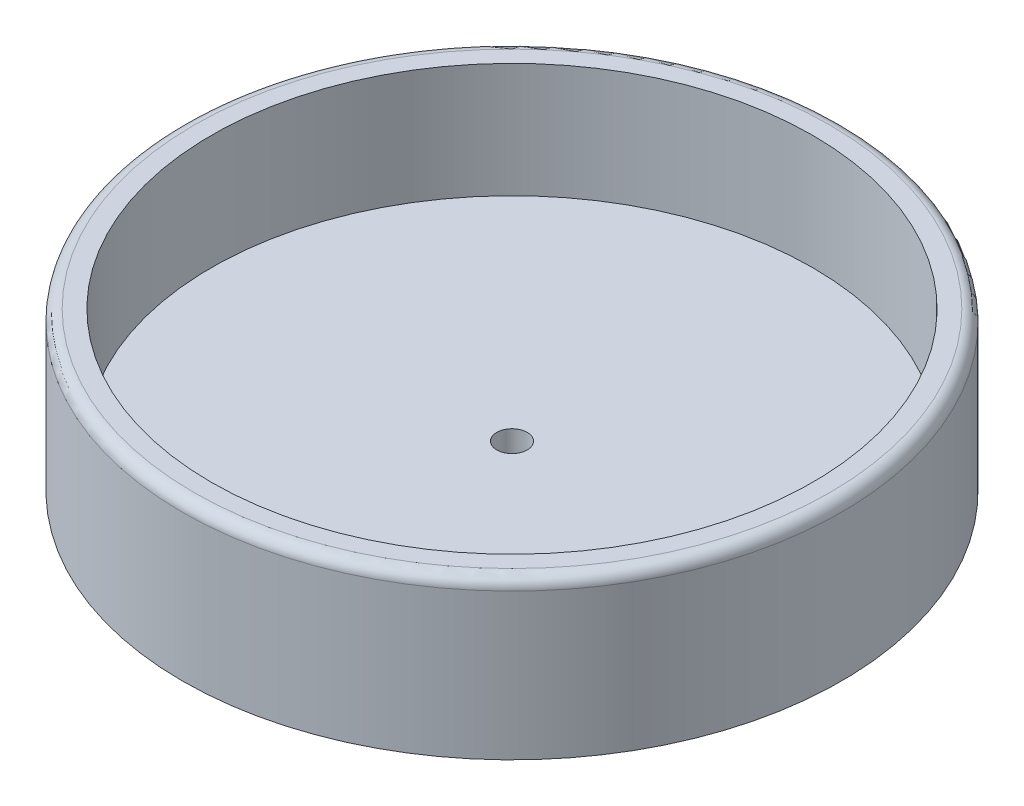
ISO-10303-21;
HEADER;
FILE_DESCRIPTION(('STEP AP214'),'2;1');
FILE_NAME('part.step','',(''),(''),'','','');
FILE_SCHEMA(('AUTOMOTIVE_DESIGN { 1 0 10303 214 1 1 1 1 }'));
ENDSEC;
DATA;
#1=APPLICATION_CONTEXT('core data for automotive mechanical design processes');
#2=APPLICATION_PROTOCOL_DEFINITION('international standard','automotive_design',2000,#1);
#3=PRODUCT_CONTEXT('',#1,'mechanical');
#4=PRODUCT('Part','Part','',(#3));
#5=PRODUCT_RELATED_PRODUCT_CATEGORY('part','',(#4));
#6=PRODUCT_DEFINITION_FORMATION('','',#4);
#7=PRODUCT_DEFINITION_CONTEXT('part definition',#1,'design');
#8=PRODUCT_DEFINITION('design','',#6,#7);
#9=PRODUCT_DEFINITION_SHAPE('','',#8);
#10=(LENGTH_UNIT() NAMED_UNIT(*) SI_UNIT(.MILLI.,.METRE.));
#11=(NAMED_UNIT(*) PLANE_ANGLE_UNIT() SI_UNIT($,.RADIAN.));
#12=(NAMED_UNIT(*) SI_UNIT($,.STERADIAN.) SOLID_ANGLE_UNIT());
#13=UNCERTAINTY_MEASURE_WITH_UNIT(LENGTH_MEASURE(1.E-05),#10,'distance_accuracy_value','');
#14=(GEOMETRIC_REPRESENTATION_CONTEXT(3) GLOBAL_UNCERTAINTY_ASSIGNED_CONTEXT((#13)) GLOBAL_UNIT_ASSIGNED_CONTEXT((#10,
#11,#12)) REPRESENTATION_CONTEXT('',''));
#15=CARTESIAN_POINT('',(0.,0.,0.));
#16=DIRECTION('',(0.,0.,1.));
#17=DIRECTION('',(1.,0.,0.));
#18=AXIS2_PLACEMENT_3D('',#15,#16,#17);
#19=CARTESIAN_POINT('',(0.,9.525,0.));
#20=DIRECTION('',(0.,-1.,0.));
#21=DIRECTION('',(0.,0.,-1.));
#22=AXIS2_PLACEMENT_3D('',#19,#20,#21);
#23=CYLINDRICAL_SURFACE('',#22,73.025);
#24=CARTESIAN_POINT('',(0.,32.385,0.));
#25=DIRECTION('',(0.,1.,0.));
#26=DIRECTION('',(0.,0.,1.));
#27=AXIS2_PLACEMENT_3D('',#24,#25,#26);
#28=CIRCLE('',#27,73.025);
#29=CARTESIAN_POINT('',(0.,32.385,-73.025));
#30=VERTEX_POINT('',#29);
#31=EDGE_CURVE('E10',#30,#30,#28,.F.);
#32=CARTESIAN_POINT('',(0.,0.,0.));
#33=DIRECTION('',(0.,1.,0.));
#34=DIRECTION('',(0.,0.,1.));
#35=AXIS2_PLACEMENT_3D('',#32,#33,#34);
#36=CIRCLE('',#35,73.025);
#37=CARTESIAN_POINT('',(0.,0.,-73.025));
#38=VERTEX_POINT('',#37);
#39=EDGE_CURVE('E59',#38,#38,#36,.T.);
#40=CARTESIAN_POINT('',(0.,32.385,-73.025));
#41=CARTESIAN_POINT('',(0.,32.04765625,-73.025));
#42=CARTESIAN_POINT('',(0.,31.7103125,-73.025));
#43=CARTESIAN_POINT('',(0.,31.035625,-73.025));
#44=CARTESIAN_POINT('',(0.,30.69828125,-73.025));
#45=CARTESIAN_POINT('',(0.,30.02359375,-73.025));
#46=CARTESIAN_POINT('',(0.,29.68625,-73.025));
#47=CARTESIAN_POINT('',(0.,29.0115625,-73.025));
#48=CARTESIAN_POINT('',(0.,28.67421875,-73.025));
#49=CARTESIAN_POINT('',(0.,27.99953125,-73.025));
#50=CARTESIAN_POINT('',(0.,27.6621875,-73.025));
#51=CARTESIAN_POINT('',(0.,26.9875,-73.025));
#52=CARTESIAN_POINT('',(0.,26.65015625,-73.025));
#53=CARTESIAN_POINT('',(0.,25.97546875,-73.025));
#54=CARTESIAN_POINT('',(0.,25.638125,-73.025));
#55=CARTESIAN_POINT('',(0.,24.9634375,-73.025));
#56=CARTESIAN_POINT('',(0.,24.62609375,-73.025));
#57=CARTESIAN_POINT('',(0.,23.95140625,-73.025));
#58=CARTESIAN_POINT('',(0.,23.6140625,-73.025));
#59=CARTESIAN_POINT('',(0.,22.939375,-73.025));
#60=CARTESIAN_POINT('',(0.,22.60203125,-73.025));
#61=CARTESIAN_POINT('',(0.,21.92734375,-73.025));
#62=CARTESIAN_POINT('',(0.,21.59,-73.025));
#63=CARTESIAN_POINT('',(0.,20.9153125,-73.025));
#64=CARTESIAN_POINT('',(0.,20.57796875,-73.025));
#65=CARTESIAN_POINT('',(0.,19.90328125,-73.025));
#66=CARTESIAN_POINT('',(0.,19.5659375,-73.025));
#67=CARTESIAN_POINT('',(0.,18.89125,-73.025));
#68=CARTESIAN_POINT('',(0.,18.55390625,-73.025));
#69=CARTESIAN_POINT('',(0.,17.87921875,-73.025));
#70=CARTESIAN_POINT('',(0.,17.541875,-73.025));
#71=CARTESIAN_POINT('',(0.,16.8671875,-73.025));
#72=CARTESIAN_POINT('',(0.,16.52984375,-73.025));
#73=CARTESIAN_POINT('',(0.,15.85515625,-73.025));
#74=CARTESIAN_POINT('',(0.,15.5178125,-73.025));
#75=CARTESIAN_POINT('',(0.,14.843125,-73.025));
#76=CARTESIAN_POINT('',(0.,14.50578125,-73.025));
#77=CARTESIAN_POINT('',(0.,13.83109375,-73.025));
#78=CARTESIAN_POINT('',(0.,13.49375,-73.025));
#79=CARTESIAN_POINT('',(0.,12.8190625,-73.025));
#80=CARTESIAN_POINT('',(0.,12.48171875,-73.025));
#81=CARTESIAN_POINT('',(0.,11.80703125,-73.025));
#82=CARTESIAN_POINT('',(0.,11.4696875,-73.025));
#83=CARTESIAN_POINT('',(0.,10.795,-73.025));
#84=CARTESIAN_POINT('',(0.,10.45765625,-73.025));
#85=CARTESIAN_POINT('',(0.,9.78296875,-73.025));
#86=CARTESIAN_POINT('',(0.,9.445625,-73.025));
#87=CARTESIAN_POINT('',(0.,8.7709375,-73.025));
#88=CARTESIAN_POINT('',(0.,8.43359375,-73.025));
#89=CARTESIAN_POINT('',(0.,7.75890625,-73.025));
#90=CARTESIAN_POINT('',(0.,7.4215625,-73.025));
#91=CARTESIAN_POINT('',(0.,6.746875,-73.025));
#92=CARTESIAN_POINT('',(0.,6.40953125,-73.025));
#93=CARTESIAN_POINT('',(0.,5.73484375,-73.025));
#94=CARTESIAN_POINT('',(0.,5.3975,-73.025));
#95=CARTESIAN_POINT('',(0.,4.7228125,-73.025));
#96=CARTESIAN_POINT('',(0.,4.38546875,-73.025));
#97=CARTESIAN_POINT('',(0.,3.71078125,-73.025));
#98=CARTESIAN_POINT('',(0.,3.3734375,-73.025));
#99=CARTESIAN_POINT('',(0.,2.69875,-73.025));
#100=CARTESIAN_POINT('',(0.,2.36140625,-73.025));
#101=CARTESIAN_POINT('',(0.,1.68671875,-73.025));
#102=CARTESIAN_POINT('',(0.,1.34937500000001,-73.025));
#103=CARTESIAN_POINT('',(0.,0.674687500000006,-73.025));
#104=CARTESIAN_POINT('',(0.,0.337343750000004,-73.025));
#105=CARTESIAN_POINT('',(0.,0.,-73.025));
#106=B_SPLINE_CURVE_WITH_KNOTS('',3,(#40,#41,#42,#43,#44,#45,#46,#47,#48,#49,#50,#51,#52,#53,
#54,#55,#56,#57,#58,#59,#60,#61,#62,#63,#64,#65,#66,#67,#68,#69,#70,#71,#72,#73,#74,#75,#76,#77,
#78,#79,#80,#81,#82,#83,#84,#85,#86,#87,#88,#89,#90,#91,#92,#93,#94,#95,#96,#97,#98,#99,#100,
#101,#102,#103,#104,#105),.UNSPECIFIED.,.F.,.F.,(4,2,2,2,2,2,2,2,2,2,2,2,2,2,2,2,2,2,2,2,2,2,2,
2,2,2,2,2,2,2,2,2,4),(0.,1.01203125,2.0240625,3.03609375,4.048125,5.06015625,6.0721875,
7.08421875,8.09625,9.10828125,10.1203125,11.13234375,12.144375,13.15640625,14.1684375,
15.18046875,16.1925,17.20453125,18.2165625,19.22859375,20.240625,21.25265625,22.2646875,
23.27671875,24.28875,25.30078125,26.3128125,27.32484375,28.336875,29.34890625,30.3609375,
31.37296875,32.385),.UNSPECIFIED.);
#107=EDGE_CURVE('BSEAM41',#30,#38,#106,.T.);
#108=ORIENTED_EDGE('',*,*,#31,.T.);
#109=ORIENTED_EDGE('',*,*,#39,.T.);
#110=ORIENTED_EDGE('',*,*,#107,.T.);
#111=ORIENTED_EDGE('',*,*,#107,.F.);
#112=EDGE_LOOP('',(#108,#110,#109,#111));
#113=FACE_BOUND('',#112,.T.);
#114=ADVANCED_FACE('F41',(#113),#23,.T.);
#115=CARTESIAN_POINT('',(0.,0.,0.));
#116=DIRECTION('',(0.,1.,0.));
#117=DIRECTION('',(0.,0.,1.));
#118=AXIS2_PLACEMENT_3D('',#115,#116,#117);
#119=PLANE('',#118);
#120=CARTESIAN_POINT('',(0.,0.,0.));
#121=DIRECTION('',(0.,-1.,0.));
#122=DIRECTION('',(0.,0.,-1.));
#123=AXIS2_PLACEMENT_3D('',#120,#121,#122);
#124=CIRCLE('',#123,7.62);
#125=CARTESIAN_POINT('',(0.,0.,-7.62));
#126=VERTEX_POINT('',#125);
#127=EDGE_CURVE('E77',#126,#126,#124,.T.);
#128=ORIENTED_EDGE('',*,*,#127,.F.);
#129=EDGE_LOOP('',(#128));
#130=FACE_BOUND('',#129,.T.);
#131=ORIENTED_EDGE('',*,*,#39,.F.);
#132=EDGE_LOOP('',(#131));
#133=FACE_BOUND('',#132,.T.);
#134=ADVANCED_FACE('F84',(#130,#133),#119,.F.);
#135=CARTESIAN_POINT('',(0.,34.925,0.));
#136=DIRECTION('',(0.,1.,0.));
#137=DIRECTION('',(0.,0.,1.));
#138=AXIS2_PLACEMENT_3D('',#135,#136,#137);
#139=PLANE('',#138);
#140=CARTESIAN_POINT('',(0.,34.925,0.));
#141=DIRECTION('',(0.,1.,0.));
#142=DIRECTION('',(0.,0.,1.));
#143=AXIS2_PLACEMENT_3D('',#140,#141,#142);
#144=CIRCLE('',#143,70.485);
#145=CARTESIAN_POINT('',(0.,34.925,70.485));
#146=VERTEX_POINT('',#145);
#147=EDGE_CURVE('E49',#146,#146,#144,.T.);
#148=ORIENTED_EDGE('',*,*,#147,.T.);
#149=EDGE_LOOP('',(#148));
#150=FACE_BOUND('',#149,.T.);
#151=CARTESIAN_POINT('',(0.,34.925,0.));
#152=DIRECTION('',(0.,1.,0.));
#153=DIRECTION('',(0.,0.,1.));
#154=AXIS2_PLACEMENT_3D('',#151,#152,#153);
#155=CIRCLE('',#154,66.6115);
#156=CARTESIAN_POINT('',(0.,34.925,66.6115));
#157=VERTEX_POINT('',#156);
#158=EDGE_CURVE('E65',#157,#157,#155,.T.);
#159=ORIENTED_EDGE('',*,*,#158,.F.);
#160=EDGE_LOOP('',(#159));
#161=FACE_BOUND('',#160,.T.);
#162=ADVANCED_FACE('F87',(#150,#161),#139,.T.);
#163=CARTESIAN_POINT('',(0.,34.925,0.));
#164=DIRECTION('',(0.,-1.,0.));
#165=DIRECTION('',(0.,0.,-1.));
#166=AXIS2_PLACEMENT_3D('',#163,#164,#165);
#167=CYLINDRICAL_SURFACE('',#166,66.6115);
#168=ORIENTED_EDGE('',*,*,#158,.T.);
#169=EDGE_LOOP('',(#168));
#170=FACE_BOUND('',#169,.T.);
#171=CARTESIAN_POINT('',(0.,9.525,0.));
#172=DIRECTION('',(0.,1.,0.));
#173=DIRECTION('',(0.,0.,1.));
#174=AXIS2_PLACEMENT_3D('',#171,#172,#173);
#175=CIRCLE('',#174,66.6115);
#176=CARTESIAN_POINT('',(0.,9.525,66.6115));
#177=VERTEX_POINT('',#176);
#178=EDGE_CURVE('E54',#177,#177,#175,.F.);
#179=ORIENTED_EDGE('',*,*,#178,.T.);
#180=EDGE_LOOP('',(#179));
#181=FACE_BOUND('',#180,.T.);
#182=ADVANCED_FACE('F99',(#170,#181),#167,.F.);
#183=CARTESIAN_POINT('',(0.,9.525,0.));
#184=DIRECTION('',(0.,1.,0.));
#185=DIRECTION('',(0.,0.,1.));
#186=AXIS2_PLACEMENT_3D('',#183,#184,#185);
#187=PLANE('',#186);
#188=CARTESIAN_POINT('',(0.,9.525,0.));
#189=DIRECTION('',(0.,1.,0.));
#190=DIRECTION('',(0.,0.,1.));
#191=AXIS2_PLACEMENT_3D('',#188,#189,#190);
#192=CIRCLE('',#191,3.3782);
#193=CARTESIAN_POINT('',(0.,9.525,3.3782));
#194=VERTEX_POINT('',#193);
#195=EDGE_CURVE('E62',#194,#194,#192,.T.);
#196=ORIENTED_EDGE('',*,*,#195,.F.);
#197=EDGE_LOOP('',(#196));
#198=FACE_BOUND('',#197,.T.);
#199=ORIENTED_EDGE('',*,*,#178,.F.);
#200=EDGE_LOOP('',(#199));
#201=FACE_BOUND('',#200,.T.);
#202=ADVANCED_FACE('F95',(#198,#201),#187,.T.);
#203=CARTESIAN_POINT('',(0.,0.,0.));
#204=DIRECTION('',(0.,-1.,0.));
#205=DIRECTION('',(0.,0.,-1.));
#206=AXIS2_PLACEMENT_3D('',#203,#204,#205);
#207=CYLINDRICAL_SURFACE('',#206,3.3782);
#208=ORIENTED_EDGE('',*,*,#195,.T.);
#209=EDGE_LOOP('',(#208));
#210=FACE_BOUND('',#209,.T.);
#211=CARTESIAN_POINT('',(0.,3.55929281552779,0.));
#212=DIRECTION('',(0.,-1.,0.));
#213=DIRECTION('',(0.,0.,-1.));
#214=AXIS2_PLACEMENT_3D('',#211,#212,#213);
#215=CIRCLE('',#214,3.3782);
#216=CARTESIAN_POINT('',(0.,3.55929281552779,-3.3782));
#217=VERTEX_POINT('',#216);
#218=EDGE_CURVE('E66',#217,#217,#215,.T.);
#219=ORIENTED_EDGE('',*,*,#218,.T.);
#220=EDGE_LOOP('',(#219));
#221=FACE_BOUND('',#220,.T.);
#222=ADVANCED_FACE('F98',(#210,#221),#207,.F.);
#223=CARTESIAN_POINT('',(0.,0.,0.));
#224=DIRECTION('',(0.,-1.,0.));
#225=DIRECTION('',(0.,0.,-1.));
#226=AXIS2_PLACEMENT_3D('',#223,#224,#225);
#227=CONICAL_SURFACE('',#226,7.62,0.872664625997165);
#228=ORIENTED_EDGE('',*,*,#218,.F.);
#229=EDGE_LOOP('',(#228));
#230=FACE_BOUND('',#229,.T.);
#231=ORIENTED_EDGE('',*,*,#127,.T.);
#232=EDGE_LOOP('',(#231));
#233=FACE_BOUND('',#232,.T.);
#234=ADVANCED_FACE('F82',(#230,#233),#227,.F.);
#235=CARTESIAN_POINT('',(0.,32.385,0.));
#236=DIRECTION('',(0.,1.,0.));
#237=DIRECTION('',(0.,0.,1.));
#238=AXIS2_PLACEMENT_3D('',#235,#236,#237);
#239=TOROIDAL_SURFACE('',#238,70.485,2.54);
#240=ORIENTED_EDGE('',*,*,#31,.F.);
#241=EDGE_LOOP('',(#240));
#242=FACE_BOUND('',#241,.T.);
#243=ORIENTED_EDGE('',*,*,#147,.F.);
#244=EDGE_LOOP('',(#243));
#245=FACE_BOUND('',#244,.T.);
#246=ADVANCED_FACE('F43',(#242,#245),#239,.T.);
#247=CLOSED_SHELL('',(#114,#134,#162,#182,#202,#222,#234,#246));
#248=MANIFOLD_SOLID_BREP('B2',#247);
#249=ADVANCED_BREP_SHAPE_REPRESENTATION('',(#18,#248),#14);
#250=SHAPE_DEFINITION_REPRESENTATION(#9,#249);
ENDSEC;
END-ISO-10303-21;
